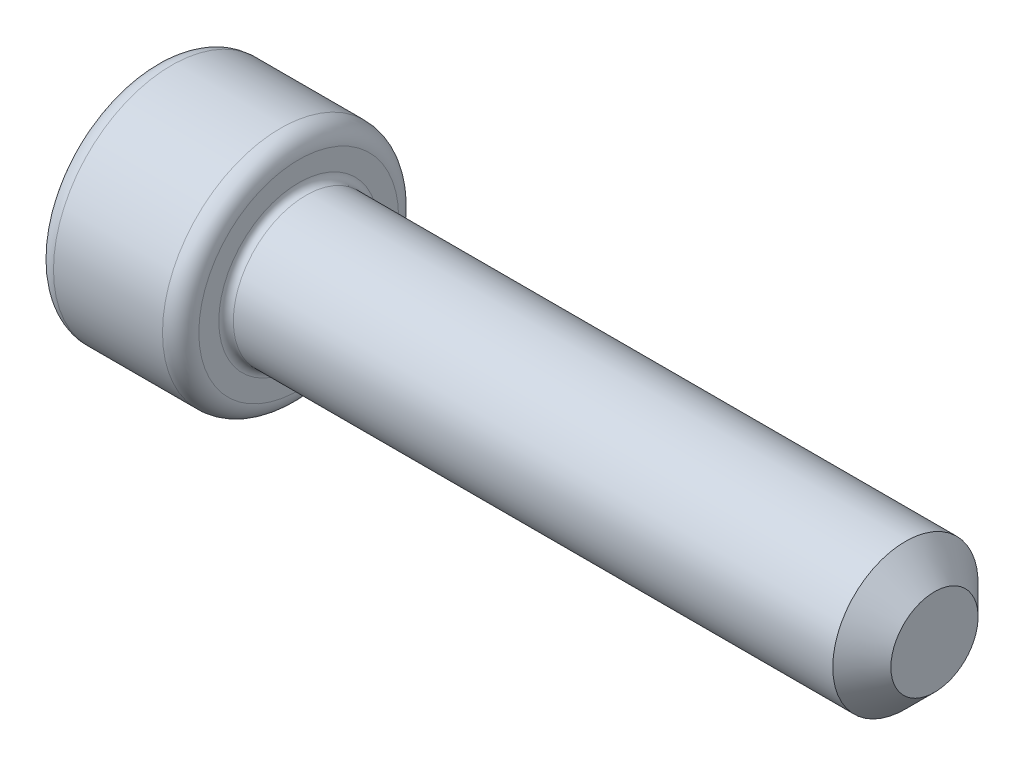
ISO-10303-21;
HEADER;
FILE_DESCRIPTION(('STEP AP214'),'2;1');
FILE_NAME('part.step','',(''),(''),'','','');
FILE_SCHEMA(('AUTOMOTIVE_DESIGN { 1 0 10303 214 1 1 1 1 }'));
ENDSEC;
DATA;
#1=APPLICATION_CONTEXT('core data for automotive mechanical design processes');
#2=APPLICATION_PROTOCOL_DEFINITION('international standard','automotive_design',2000,#1);
#3=PRODUCT_CONTEXT('',#1,'mechanical');
#4=PRODUCT('Part','Part','',(#3));
#5=PRODUCT_RELATED_PRODUCT_CATEGORY('part','',(#4));
#6=PRODUCT_DEFINITION_FORMATION('','',#4);
#7=PRODUCT_DEFINITION_CONTEXT('part definition',#1,'design');
#8=PRODUCT_DEFINITION('design','',#6,#7);
#9=PRODUCT_DEFINITION_SHAPE('','',#8);
#10=(LENGTH_UNIT() NAMED_UNIT(*) SI_UNIT(.MILLI.,.METRE.));
#11=(NAMED_UNIT(*) PLANE_ANGLE_UNIT() SI_UNIT($,.RADIAN.));
#12=(NAMED_UNIT(*) SI_UNIT($,.STERADIAN.) SOLID_ANGLE_UNIT());
#13=UNCERTAINTY_MEASURE_WITH_UNIT(LENGTH_MEASURE(1.E-05),#10,'distance_accuracy_value','');
#14=(GEOMETRIC_REPRESENTATION_CONTEXT(3) GLOBAL_UNCERTAINTY_ASSIGNED_CONTEXT((#13)) GLOBAL_UNIT_ASSIGNED_CONTEXT((#10,
#11,#12)) REPRESENTATION_CONTEXT('',''));
#15=CARTESIAN_POINT('',(0.,0.,0.));
#16=DIRECTION('',(0.,0.,1.));
#17=DIRECTION('',(1.,0.,0.));
#18=AXIS2_PLACEMENT_3D('',#15,#16,#17);
#19=CARTESIAN_POINT('',(0.,0.,0.));
#20=DIRECTION('',(1.,0.,0.));
#21=DIRECTION('',(0.,0.,-1.));
#22=AXIS2_PLACEMENT_3D('',#19,#20,#21);
#23=PLANE('',#22);
#24=CARTESIAN_POINT('',(0.,0.,0.));
#25=DIRECTION('',(-1.,0.,0.));
#26=DIRECTION('',(0.,0.,1.));
#27=AXIS2_PLACEMENT_3D('',#24,#25,#26);
#28=CIRCLE('',#27,3.6);
#29=CARTESIAN_POINT('',(0.,0.,3.6));
#30=VERTEX_POINT('',#29);
#31=EDGE_CURVE('E201',#30,#30,#28,.T.);
#32=ORIENTED_EDGE('',*,*,#31,.F.);
#33=EDGE_LOOP('',(#32));
#34=FACE_BOUND('',#33,.T.);
#35=CARTESIAN_POINT('',(0.,0.,0.));
#36=DIRECTION('',(-1.,0.,0.));
#37=DIRECTION('',(0.,0.,1.));
#38=AXIS2_PLACEMENT_3D('',#35,#36,#37);
#39=CIRCLE('',#38,5.49999999999999);
#40=CARTESIAN_POINT('',(0.,0.,5.49999999999999));
#41=VERTEX_POINT('',#40);
#42=EDGE_CURVE('E51',#41,#41,#39,.T.);
#43=ORIENTED_EDGE('',*,*,#42,.T.);
#44=EDGE_LOOP('',(#43));
#45=FACE_BOUND('',#44,.T.);
#46=ADVANCED_FACE('F38',(#34,#45),#23,.F.);
#47=CARTESIAN_POINT('',(1.,0.,0.));
#48=DIRECTION('',(-1.,0.,0.));
#49=DIRECTION('',(0.,0.,1.));
#50=AXIS2_PLACEMENT_3D('',#47,#48,#49);
#51=TOROIDAL_SURFACE('',#50,5.5,1.);
#52=ORIENTED_EDGE('',*,*,#42,.F.);
#53=EDGE_LOOP('',(#52));
#54=FACE_BOUND('',#53,.T.);
#55=CARTESIAN_POINT('',(1.,0.,0.));
#56=DIRECTION('',(-1.,0.,0.));
#57=DIRECTION('',(0.,0.,1.));
#58=AXIS2_PLACEMENT_3D('',#55,#56,#57);
#59=CIRCLE('',#58,6.5);
#60=CARTESIAN_POINT('',(1.,0.,6.5));
#61=VERTEX_POINT('',#60);
#62=EDGE_CURVE('E139',#61,#61,#59,.T.);
#63=ORIENTED_EDGE('',*,*,#62,.T.);
#64=EDGE_LOOP('',(#63));
#65=FACE_BOUND('',#64,.T.);
#66=ADVANCED_FACE('F145',(#54,#65),#51,.T.);
#67=CARTESIAN_POINT('',(-7.64950422230815,0.,0.));
#68=DIRECTION('',(-1.,0.,0.));
#69=DIRECTION('',(0.,0.,1.));
#70=AXIS2_PLACEMENT_3D('',#67,#68,#69);
#71=CYLINDRICAL_SURFACE('',#70,6.5);
#72=ORIENTED_EDGE('',*,*,#62,.F.);
#73=EDGE_LOOP('',(#72));
#74=FACE_BOUND('',#73,.T.);
#75=CARTESIAN_POINT('',(6.99999999999998,0.,0.));
#76=DIRECTION('',(-1.,0.,0.));
#77=DIRECTION('',(0.,0.,1.));
#78=AXIS2_PLACEMENT_3D('',#75,#76,#77);
#79=CIRCLE('',#78,6.5);
#80=CARTESIAN_POINT('',(6.99999999999998,0.,6.5));
#81=VERTEX_POINT('',#80);
#82=EDGE_CURVE('E136',#81,#81,#79,.T.);
#83=ORIENTED_EDGE('',*,*,#82,.T.);
#84=EDGE_LOOP('',(#83));
#85=FACE_BOUND('',#84,.T.);
#86=ADVANCED_FACE('F148',(#74,#85),#71,.T.);
#87=CARTESIAN_POINT('',(7.00000000000001,0.,0.));
#88=DIRECTION('',(-1.,0.,0.));
#89=DIRECTION('',(0.,0.,1.));
#90=AXIS2_PLACEMENT_3D('',#87,#88,#89);
#91=TOROIDAL_SURFACE('',#90,5.5,1.);
#92=ORIENTED_EDGE('',*,*,#82,.F.);
#93=EDGE_LOOP('',(#92));
#94=FACE_BOUND('',#93,.T.);
#95=CARTESIAN_POINT('',(8.00000000000001,0.,0.));
#96=DIRECTION('',(-1.,0.,0.));
#97=DIRECTION('',(0.,0.,1.));
#98=AXIS2_PLACEMENT_3D('',#95,#96,#97);
#99=CIRCLE('',#98,5.49999999999999);
#100=CARTESIAN_POINT('',(8.00000000000001,0.,5.49999999999999));
#101=VERTEX_POINT('',#100);
#102=EDGE_CURVE('E133',#101,#101,#99,.T.);
#103=ORIENTED_EDGE('',*,*,#102,.T.);
#104=EDGE_LOOP('',(#103));
#105=FACE_BOUND('',#104,.T.);
#106=ADVANCED_FACE('F153',(#94,#105),#91,.T.);
#107=CARTESIAN_POINT('',(8.00000000000001,5.49999999999999,0.));
#108=DIRECTION('',(-1.,0.,0.));
#109=DIRECTION('',(0.,0.,1.));
#110=AXIS2_PLACEMENT_3D('',#107,#108,#109);
#111=PLANE('',#110);
#112=ORIENTED_EDGE('',*,*,#102,.F.);
#113=EDGE_LOOP('',(#112));
#114=FACE_BOUND('',#113,.T.);
#115=CARTESIAN_POINT('',(8.00000000000001,0.,0.));
#116=DIRECTION('',(-1.,0.,0.));
#117=DIRECTION('',(0.,0.,1.));
#118=AXIS2_PLACEMENT_3D('',#115,#116,#117);
#119=CIRCLE('',#118,4.4);
#120=CARTESIAN_POINT('',(8.00000000000001,0.,4.4));
#121=VERTEX_POINT('',#120);
#122=EDGE_CURVE('E130',#121,#121,#119,.T.);
#123=ORIENTED_EDGE('',*,*,#122,.T.);
#124=EDGE_LOOP('',(#123));
#125=FACE_BOUND('',#124,.T.);
#126=ADVANCED_FACE('F159',(#114,#125),#111,.F.);
#127=CARTESIAN_POINT('',(8.39999999999999,0.,0.));
#128=DIRECTION('',(-1.,0.,0.));
#129=DIRECTION('',(0.,0.,1.));
#130=AXIS2_PLACEMENT_3D('',#127,#128,#129);
#131=TOROIDAL_SURFACE('',#130,4.4,0.4);
#132=ORIENTED_EDGE('',*,*,#122,.F.);
#133=EDGE_LOOP('',(#132));
#134=FACE_BOUND('',#133,.T.);
#135=CARTESIAN_POINT('',(8.39999999999999,0.,0.));
#136=DIRECTION('',(-1.,0.,0.));
#137=DIRECTION('',(0.,0.,1.));
#138=AXIS2_PLACEMENT_3D('',#135,#136,#137);
#139=CIRCLE('',#138,4.);
#140=CARTESIAN_POINT('',(8.39999999999999,0.,4.));
#141=VERTEX_POINT('',#140);
#142=EDGE_CURVE('E127',#141,#141,#139,.T.);
#143=ORIENTED_EDGE('',*,*,#142,.T.);
#144=EDGE_LOOP('',(#143));
#145=FACE_BOUND('',#144,.T.);
#146=ADVANCED_FACE('F165',(#134,#145),#131,.F.);
#147=CARTESIAN_POINT('',(-7.64950422230815,0.,0.));
#148=DIRECTION('',(-1.,0.,0.));
#149=DIRECTION('',(0.,0.,1.));
#150=AXIS2_PLACEMENT_3D('',#147,#148,#149);
#151=CYLINDRICAL_SURFACE('',#150,4.);
#152=ORIENTED_EDGE('',*,*,#142,.F.);
#153=EDGE_LOOP('',(#152));
#154=FACE_BOUND('',#153,.T.);
#155=CARTESIAN_POINT('',(41.4,0.,0.));
#156=DIRECTION('',(-1.,0.,0.));
#157=DIRECTION('',(0.,0.,1.));
#158=AXIS2_PLACEMENT_3D('',#155,#156,#157);
#159=CIRCLE('',#158,4.);
#160=CARTESIAN_POINT('',(41.4,0.,4.));
#161=VERTEX_POINT('',#160);
#162=EDGE_CURVE('E124',#161,#161,#159,.T.);
#163=ORIENTED_EDGE('',*,*,#162,.T.);
#164=EDGE_LOOP('',(#163));
#165=FACE_BOUND('',#164,.T.);
#166=ADVANCED_FACE('F171',(#154,#165),#151,.T.);
#167=CARTESIAN_POINT('',(43.,0.,0.));
#168=DIRECTION('',(-1.,0.,0.));
#169=DIRECTION('',(0.,0.,1.));
#170=AXIS2_PLACEMENT_3D('',#167,#168,#169);
#171=CONICAL_SURFACE('',#170,2.40000000000001,0.785398163397445);
#172=ORIENTED_EDGE('',*,*,#162,.F.);
#173=EDGE_LOOP('',(#172));
#174=FACE_BOUND('',#173,.T.);
#175=CARTESIAN_POINT('',(43.,0.,0.));
#176=DIRECTION('',(-1.,0.,0.));
#177=DIRECTION('',(0.,0.,1.));
#178=AXIS2_PLACEMENT_3D('',#175,#176,#177);
#179=CIRCLE('',#178,2.40000000000001);
#180=CARTESIAN_POINT('',(43.,0.,2.40000000000001));
#181=VERTEX_POINT('',#180);
#182=EDGE_CURVE('E121',#181,#181,#179,.T.);
#183=ORIENTED_EDGE('',*,*,#182,.T.);
#184=EDGE_LOOP('',(#183));
#185=FACE_BOUND('',#184,.T.);
#186=ADVANCED_FACE('F177',(#174,#185),#171,.T.);
#187=CARTESIAN_POINT('',(43.,2.4,0.));
#188=DIRECTION('',(-1.,0.,0.));
#189=DIRECTION('',(0.,0.,1.));
#190=AXIS2_PLACEMENT_3D('',#187,#188,#189);
#191=PLANE('',#190);
#192=ORIENTED_EDGE('',*,*,#182,.F.);
#193=EDGE_LOOP('',(#192));
#194=FACE_BOUND('',#193,.T.);
#195=ADVANCED_FACE('F183',(#194),#191,.F.);
#196=CARTESIAN_POINT('',(0.,0.,0.));
#197=DIRECTION('',(-1.,0.,0.));
#198=DIRECTION('',(0.,0.,1.));
#199=AXIS2_PLACEMENT_3D('',#196,#197,#198);
#200=CONICAL_SURFACE('',#199,3.6,1.0471975511966);
#201=ORIENTED_EDGE('',*,*,#31,.T.);
#202=EDGE_LOOP('',(#201));
#203=FACE_BOUND('',#202,.T.);
#204=CARTESIAN_POINT('',(-1.04835789150273,-4.50898974946003,3.));
#205=CARTESIAN_POINT('',(-0.985911238204783,-4.37903809437817,3.));
#206=CARTESIAN_POINT('',(-0.924106690829709,-4.24877207386613,3.));
#207=CARTESIAN_POINT('',(-0.802146398263959,-3.98744339453181,3.));
#208=CARTESIAN_POINT('',(-0.741990946096186,-3.85638059912323,3.));
#209=CARTESIAN_POINT('',(-0.623359494782001,-3.59254393501441,3.));
#210=CARTESIAN_POINT('',(-0.564895796011378,-3.45976451486919,3.));
#211=CARTESIAN_POINT('',(-0.450563076831188,-3.19309725751099,3.));
#212=CARTESIAN_POINT('',(-0.394693922499953,-3.05920947792907,3.));
#213=CARTESIAN_POINT('',(-0.284783756133582,-2.78649755356327,3.));
#214=CARTESIAN_POINT('',(-0.230831867763873,-2.64763727867531,3.));
#215=CARTESIAN_POINT('',(-0.127370015690071,-2.36824044859189,3.));
#216=CARTESIAN_POINT('',(-0.0778605688823405,-2.22770370048162,3.));
#217=CARTESIAN_POINT('',(0.0153111771317814,-1.94504299566512,3.));
#218=CARTESIAN_POINT('',(0.0589866575678043,-1.80292343086955,3.));
#219=CARTESIAN_POINT('',(0.138996373418,-1.51665362384108,3.));
#220=CARTESIAN_POINT('',(0.175333076440408,-1.37250408167064,3.));
#221=CARTESIAN_POINT('',(0.238660111327763,-1.08280597738231,3.));
#222=CARTESIAN_POINT('',(0.265691713100037,-0.937266614059745,3.));
#223=CARTESIAN_POINT('',(0.308767757563844,-0.644539950176818,3.));
#224=CARTESIAN_POINT('',(0.324812982453669,-0.49735276769492,3.));
#225=CARTESIAN_POINT('',(0.344426805068411,-0.203920340872737,3.));
#226=CARTESIAN_POINT('',(0.348144211143898,-0.0576852900481501,3.));
#227=CARTESIAN_POINT('',(0.343170862899566,0.23458302767709,3.));
#228=CARTESIAN_POINT('',(0.334479369322416,0.380616282036957,3.));
#229=CARTESIAN_POINT('',(0.309328698694609,0.63294787460275,3.));
#230=CARTESIAN_POINT('',(0.29553686635057,0.739525196673388,3.));
#231=CARTESIAN_POINT('',(0.262284498813591,0.951798190917157,3.));
#232=CARTESIAN_POINT('',(0.242823068521992,1.05749372116328,3.));
#233=CARTESIAN_POINT('',(0.176968568275512,1.37316914905562,3.));
#234=CARTESIAN_POINT('',(0.123120104686075,1.58160565192266,3.));
#235=CARTESIAN_POINT('',(0.0310004463679456,1.89327160259638,3.));
#236=CARTESIAN_POINT('',(-0.00202524580029439,1.99814168475835,3.));
#237=CARTESIAN_POINT('',(-0.0711849641149794,2.20686176005444,3.));
#238=CARTESIAN_POINT('',(-0.107319012615844,2.31071174584634,3.));
#239=CARTESIAN_POINT('',(-0.18214249236627,2.51743253506361,3.));
#240=CARTESIAN_POINT('',(-0.22083091339055,2.62030370739977,3.));
#241=CARTESIAN_POINT('',(-0.300340275663556,2.82521425892785,3.));
#242=CARTESIAN_POINT('',(-0.341161180550521,2.92725365226846,3.));
#243=CARTESIAN_POINT('',(-0.448689355361287,3.18939644158424,2.99999999999999));
#244=CARTESIAN_POINT('',(-0.516716576635534,3.34895772998079,3.));
#245=CARTESIAN_POINT('',(-0.656101349622328,3.66662357627897,3.));
#246=CARTESIAN_POINT('',(-0.727459160036441,3.82472801987508,3.));
#247=CARTESIAN_POINT('',(-0.872748269669411,4.13979429327009,3.));
#248=CARTESIAN_POINT('',(-0.946680203051514,4.29675582981948,3.));
#249=CARTESIAN_POINT('',(-1.09654235660517,4.60972357454948,3.));
#250=CARTESIAN_POINT('',(-1.17247262255264,4.76572976074474,3.));
#251=CARTESIAN_POINT('',(-1.40279510057643,5.23296563982451,3.));
#252=CARTESIAN_POINT('',(-1.55954155966157,5.54303366901108,3.));
#253=CARTESIAN_POINT('',(-1.87706499490211,6.16102652227095,3.));
#254=CARTESIAN_POINT('',(-2.03784136694506,6.46895165884097,3.));
#255=CARTESIAN_POINT('',(-2.34667843490758,7.05394853100212,3.));
#256=CARTESIAN_POINT('',(-2.49448480186027,7.33115475101331,3.));
#257=CARTESIAN_POINT('',(-2.79178323041716,7.8846761646015,3.));
#258=CARTESIAN_POINT('',(-2.94127536620042,8.16099131827539,3.));
#259=CARTESIAN_POINT('',(-3.24113027332733,8.71221478444681,3.));
#260=CARTESIAN_POINT('',(-3.39148975839338,8.98712488660683,3.));
#261=CARTESIAN_POINT('',(-3.69318538447465,9.53638759945032,3.));
#262=CARTESIAN_POINT('',(-3.8445214669107,9.8107402422974,3.));
#263=CARTESIAN_POINT('',(-3.99621539628012,10.0848935954569,3.));
#264=B_SPLINE_CURVE_WITH_KNOTS('',3,(#204,#205,#206,#207,#208,#209,#210,#211,#212,#213,#214,
#215,#216,#217,#218,#219,#220,#221,#222,#223,#224,#225,#226,#227,#228,#229,#230,#231,#232,#233,
#234,#235,#236,#237,#238,#239,#240,#241,#242,#243,#244,#245,#246,#247,#248,#249,#250,#251,#252,
#253,#254,#255,#256,#257,#258,#259,#260,#261,#262,#263),.UNSPECIFIED.,.F.,.F.,(4,2,2,2,2,2,2,2,
2,2,2,2,2,2,2,2,2,2,2,2,2,2,2,2,2,2,2,2,2,4),(0.,0.432537156188422,0.865150676924343,
1.30037033260171,1.73556749867679,2.1824281284207,2.62934068499826,3.07522576459038,
3.52096066818469,3.96469238116995,4.40839249845344,4.84671685765639,5.28506733102149,
5.60730635380346,5.92959627828533,6.57457353681956,6.90439201959964,7.2342128745393,
7.56390406150447,7.89358962861843,8.41390703437019,8.93426492295023,9.45475192728976,
9.97525086485006,11.0175038591111,12.0596015358246,13.0020426274196,13.9445253524483,
14.8845507308599,15.8245202384158),.UNSPECIFIED.);
#265=CARTESIAN_POINT('',(0.0784609690825389,-1.73205080756888,3.));
#266=VERTEX_POINT('',#265);
#267=CARTESIAN_POINT('',(0.0784609690825389,1.73205080756888,3.));
#268=VERTEX_POINT('',#267);
#269=EDGE_CURVE('E105',#266,#268,#264,.T.);
#270=ORIENTED_EDGE('',*,*,#269,.F.);
#271=CARTESIAN_POINT('',(0.078394299082768,-3.4642170851916,-0.000199999999998812));
#272=CARTESIAN_POINT('',(0.122356457061476,-3.38810199317915,0.131635206588335));
#273=CARTESIAN_POINT('',(0.162338575221149,-3.31132988107607,0.264608405355253));
#274=CARTESIAN_POINT('',(0.232128081068301,-3.15645624025988,0.532857420002057));
#275=CARTESIAN_POINT('',(0.261910779248382,-3.078351959461,0.668138002634338));
#276=CARTESIAN_POINT('',(0.308272322302523,-2.9231113635806,0.937022602096474));
#277=CARTESIAN_POINT('',(0.325159720390847,-2.84599893549863,1.07058524542945));
#278=CARTESIAN_POINT('',(0.34532051906522,-2.69141120014111,1.33833905729568));
#279=CARTESIAN_POINT('',(0.348610613732591,-2.61393645482892,1.47252925247983));
#280=CARTESIAN_POINT('',(0.341769630628292,-2.46916798492017,1.72327559769581));
#281=CARTESIAN_POINT('',(0.333318247321131,-2.40185259973206,1.83986926497268));
#282=CARTESIAN_POINT('',(0.306531218506758,-2.2676603930218,2.07229698497465));
#283=CARTESIAN_POINT('',(0.288186420652061,-2.2007840357172,2.18813023365135));
#284=CARTESIAN_POINT('',(0.242325410660436,-2.06631510305814,2.42103725705638));
#285=CARTESIAN_POINT('',(0.214614776250691,-1.9987395487233,2.53808155051396));
#286=CARTESIAN_POINT('',(0.151722366376361,-1.86459637060759,2.77042435049914));
#287=CARTESIAN_POINT('',(0.116555370492182,-1.79802702797161,2.88572583417112));
#288=CARTESIAN_POINT('',(0.0783942990826569,-1.73193533751504,3.0002));
#289=B_SPLINE_CURVE_WITH_KNOTS('',3,(#271,#272,#273,#274,#275,#276,#277,#278,#279,#280,#281,
#282,#283,#284,#285,#286,#287,#288),.UNSPECIFIED.,.F.,.F.,(4,2,2,2,2,2,2,2,4),(0.,
0.475539830103044,0.952222784107952,1.41710776961286,1.88142182298025,2.28572436316091,
2.6904015647504,3.10405572063577,3.51689749407072),.UNSPECIFIED.);
#290=CARTESIAN_POINT('',(0.0784609690826499,-3.46410161513776,0.));
#291=VERTEX_POINT('',#290);
#292=EDGE_CURVE('E268',#291,#266,#289,.T.);
#293=ORIENTED_EDGE('',*,*,#292,.F.);
#294=CARTESIAN_POINT('',(0.0783942990826847,-1.73193533751504,-3.0002));
#295=CARTESIAN_POINT('',(0.122356457061442,-1.80805042952748,-2.86836479341168));
#296=CARTESIAN_POINT('',(0.162338575221137,-1.88482254163056,-2.73539159464476));
#297=CARTESIAN_POINT('',(0.232128081068309,-2.03969618244675,-2.46714257999796));
#298=CARTESIAN_POINT('',(0.261910779248386,-2.11780046324563,-2.33186199736567));
#299=CARTESIAN_POINT('',(0.30827232230252,-2.27304105912604,-2.06297739790353));
#300=CARTESIAN_POINT('',(0.32515972039084,-2.35015348720801,-1.92941475457055));
#301=CARTESIAN_POINT('',(0.345320519065229,-2.50474122256553,-1.66166094270432));
#302=CARTESIAN_POINT('',(0.34861061373262,-2.58221596787771,-1.52747074752016));
#303=CARTESIAN_POINT('',(0.341769630628318,-2.72698443778647,-1.27672440230419));
#304=CARTESIAN_POINT('',(0.333318247321138,-2.79429982297457,-1.16013073502732));
#305=CARTESIAN_POINT('',(0.306531218506754,-2.92849202968484,-0.927703015025358));
#306=CARTESIAN_POINT('',(0.288186420652064,-2.99536838698944,-0.811869766348665));
#307=CARTESIAN_POINT('',(0.242325410660439,-3.12983731964849,-0.578962742943631));
#308=CARTESIAN_POINT('',(0.214614776250687,-3.19741287398332,-0.46191844948606));
#309=CARTESIAN_POINT('',(0.151722366376375,-3.33155605209904,-0.229575649500878));
#310=CARTESIAN_POINT('',(0.116555370492224,-3.39812539473502,-0.114274165828895));
#311=CARTESIAN_POINT('',(0.078394299082768,-3.4642170851916,0.000199999999998812));
#312=B_SPLINE_CURVE_WITH_KNOTS('',3,(#294,#295,#296,#297,#298,#299,#300,#301,#302,#303,#304,
#305,#306,#307,#308,#309,#310,#311),.UNSPECIFIED.,.F.,.F.,(4,2,2,2,2,2,2,2,4),(0.,
0.475539830103052,0.95222278410797,1.41710776961289,1.88142182298028,2.28572436316093,
2.69040156475041,3.10405572063577,3.51689749407072),.UNSPECIFIED.);
#313=CARTESIAN_POINT('',(0.0784609690825944,-1.73205080756888,-3.));
#314=VERTEX_POINT('',#313);
#315=EDGE_CURVE('E203',#314,#291,#312,.T.);
#316=ORIENTED_EDGE('',*,*,#315,.F.);
#317=CARTESIAN_POINT('',(-1.0483578915027,-4.50898974946003,-3.));
#318=CARTESIAN_POINT('',(-0.98591123820477,-4.37903809437817,-3.));
#319=CARTESIAN_POINT('',(-0.924106690829702,-4.24877207386612,-3.));
#320=CARTESIAN_POINT('',(-0.802146398263958,-3.9874433945318,-3.));
#321=CARTESIAN_POINT('',(-0.741990946096183,-3.85638059912322,-3.));
#322=CARTESIAN_POINT('',(-0.623359494781997,-3.5925439350144,-3.));
#323=CARTESIAN_POINT('',(-0.564895796011375,-3.45976451486918,-3.));
#324=CARTESIAN_POINT('',(-0.450563076831184,-3.19309725751098,-3.));
#325=CARTESIAN_POINT('',(-0.394693922499949,-3.05920947792906,-3.));
#326=CARTESIAN_POINT('',(-0.284783756133578,-2.78649755356325,-3.));
#327=CARTESIAN_POINT('',(-0.230831867763869,-2.6476372786753,-3.));
#328=CARTESIAN_POINT('',(-0.127370015690067,-2.36824044859188,-3.));
#329=CARTESIAN_POINT('',(-0.0778605688823345,-2.2277037004816,-3.));
#330=CARTESIAN_POINT('',(0.0153111771317832,-1.9450429956651,-3.));
#331=CARTESIAN_POINT('',(0.0589866575678006,-1.80292343086953,-3.));
#332=CARTESIAN_POINT('',(0.13899637341801,-1.51665362384107,-3.));
#333=CARTESIAN_POINT('',(0.175333076440437,-1.37250408167063,-3.));
#334=CARTESIAN_POINT('',(0.23866011132779,-1.08280597738231,-3.));
#335=CARTESIAN_POINT('',(0.265691713100044,-0.937266614059742,-3.));
#336=CARTESIAN_POINT('',(0.308767757563838,-0.644539950176813,-3.));
#337=CARTESIAN_POINT('',(0.324812982453669,-0.497352767694917,-3.));
#338=CARTESIAN_POINT('',(0.34442680506841,-0.203920340872735,-3.));
#339=CARTESIAN_POINT('',(0.34814421114389,-0.0576852900481483,-3.));
#340=CARTESIAN_POINT('',(0.343170862899575,0.234583027677093,-3.));
#341=CARTESIAN_POINT('',(0.334479369322447,0.38061628203696,-3.));
#342=CARTESIAN_POINT('',(0.309328698694634,0.632947874602751,-3.));
#343=CARTESIAN_POINT('',(0.295536866350577,0.739525196673386,-3.));
#344=CARTESIAN_POINT('',(0.262284498813585,0.951798190917152,-3.));
#345=CARTESIAN_POINT('',(0.242823068521991,1.05749372116328,-3.));
#346=CARTESIAN_POINT('',(0.176968568275519,1.37316914905561,-3.));
#347=CARTESIAN_POINT('',(0.123120104686078,1.58160565192265,-3.));
#348=CARTESIAN_POINT('',(0.0310004463679468,1.89327160259638,-3.));
#349=CARTESIAN_POINT('',(-0.00202524580029321,1.99814168475834,-3.));
#350=CARTESIAN_POINT('',(-0.0711849641149772,2.20686176005443,-3.));
#351=CARTESIAN_POINT('',(-0.107319012615841,2.31071174584633,-3.));
#352=CARTESIAN_POINT('',(-0.182142492366269,2.5174325350636,-3.));
#353=CARTESIAN_POINT('',(-0.220830913390553,2.62030370739977,-3.));
#354=CARTESIAN_POINT('',(-0.300340275663548,2.82521425892785,-3.));
#355=CARTESIAN_POINT('',(-0.341161180550497,2.92725365226846,-3.));
#356=CARTESIAN_POINT('',(-0.448689355361252,3.18939644158425,-3.));
#357=CARTESIAN_POINT('',(-0.516716576635522,3.34895772998079,-3.));
#358=CARTESIAN_POINT('',(-0.656101349622332,3.66662357627895,-3.));
#359=CARTESIAN_POINT('',(-0.727459160036438,3.82472801987507,-3.));
#360=CARTESIAN_POINT('',(-0.872748269669403,4.13979429327008,-3.));
#361=CARTESIAN_POINT('',(-0.946680203051507,4.29675582981947,-3.));
#362=CARTESIAN_POINT('',(-1.09654235660517,4.60972357454947,-3.));
#363=CARTESIAN_POINT('',(-1.17247262255264,4.76572976074473,-3.));
#364=CARTESIAN_POINT('',(-1.40279510057642,5.2329656398245,-3.));
#365=CARTESIAN_POINT('',(-1.55954155966157,5.54303366901107,-3.));
#366=CARTESIAN_POINT('',(-1.87706499490211,6.16102652227094,-3.));
#367=CARTESIAN_POINT('',(-2.03784136694505,6.46895165884096,-3.));
#368=CARTESIAN_POINT('',(-2.34667843490757,7.05394853100211,-3.));
#369=CARTESIAN_POINT('',(-2.49448480186027,7.3311547510133,-3.));
#370=CARTESIAN_POINT('',(-2.79178323041715,7.88467616460149,-3.));
#371=CARTESIAN_POINT('',(-2.94127536620042,8.16099131827538,-3.));
#372=CARTESIAN_POINT('',(-3.24113027332733,8.7122147844468,-3.));
#373=CARTESIAN_POINT('',(-3.39148975839338,8.98712488660682,-3.));
#374=CARTESIAN_POINT('',(-3.69318538447464,9.53638759945031,-3.));
#375=CARTESIAN_POINT('',(-3.84452146691068,9.81074024229739,-3.));
#376=CARTESIAN_POINT('',(-3.99621539628009,10.0848935954569,-3.));
#377=B_SPLINE_CURVE_WITH_KNOTS('',3,(#317,#318,#319,#320,#321,#322,#323,#324,#325,#326,#327,
#328,#329,#330,#331,#332,#333,#334,#335,#336,#337,#338,#339,#340,#341,#342,#343,#344,#345,#346,
#347,#348,#349,#350,#351,#352,#353,#354,#355,#356,#357,#358,#359,#360,#361,#362,#363,#364,#365,
#366,#367,#368,#369,#370,#371,#372,#373,#374,#375,#376),.UNSPECIFIED.,.F.,.F.,(4,2,2,2,2,2,2,2,
2,2,2,2,2,2,2,2,2,2,2,2,2,2,2,2,2,2,2,2,2,4),(0.,0.432537156188419,0.865150676924337,
1.3003703326017,1.73556749867678,2.1824281284207,2.62934068499826,3.07522576459038,
3.52096066818468,3.96469238116995,4.40839249845344,4.84671685765638,5.28506733102148,
5.60730635380345,5.92959627828531,6.57457353681954,6.90439201959962,7.23421287453928,
7.56390406150445,7.89358962861841,8.41390703437017,8.93426492295021,9.45475192728974,
9.97525086485004,11.017503859111,12.0596015358246,13.0020426274196,13.9445253524483,
14.8845507308599,15.8245202384158),.UNSPECIFIED.);
#378=CARTESIAN_POINT('',(0.0784609690825944,1.73205080756888,-3.));
#379=VERTEX_POINT('',#378);
#380=EDGE_CURVE('E58',#379,#314,#377,.F.);
#381=ORIENTED_EDGE('',*,*,#380,.F.);
#382=CARTESIAN_POINT('',(0.078394299082768,3.46421708519159,0.000199999999998812));
#383=CARTESIAN_POINT('',(0.122356457061476,3.38810199317915,-0.131635206588334));
#384=CARTESIAN_POINT('',(0.16233857522115,3.31132988107606,-0.264608405355253));
#385=CARTESIAN_POINT('',(0.232128081068306,3.15645624025988,-0.532857420002058));
#386=CARTESIAN_POINT('',(0.261910779248387,3.078351959461,-0.668138002634341));
#387=CARTESIAN_POINT('',(0.308272322302524,2.92311136358059,-0.937022602096479));
#388=CARTESIAN_POINT('',(0.325159720390843,2.84599893549862,-1.07058524542946));
#389=CARTESIAN_POINT('',(0.34532051906523,2.6914112001411,-1.33833905729569));
#390=CARTESIAN_POINT('',(0.34861061373262,2.61393645482892,-1.47252925247984));
#391=CARTESIAN_POINT('',(0.341769630628318,2.46916798492017,-1.72327559769581));
#392=CARTESIAN_POINT('',(0.333318247321139,2.40185259973206,-1.83986926497268));
#393=CARTESIAN_POINT('',(0.306531218506753,2.26766039302179,-2.07229698497465));
#394=CARTESIAN_POINT('',(0.288186420652062,2.20078403571719,-2.18813023365134));
#395=CARTESIAN_POINT('',(0.24232541066044,2.06631510305814,-2.42103725705638));
#396=CARTESIAN_POINT('',(0.214614776250693,1.9987395487233,-2.53808155051395));
#397=CARTESIAN_POINT('',(0.151722366376365,1.86459637060759,-2.77042435049914));
#398=CARTESIAN_POINT('',(0.116555370492192,1.79802702797161,-2.88572583417112));
#399=CARTESIAN_POINT('',(0.0783942990826847,1.73193533751504,-3.0002));
#400=B_SPLINE_CURVE_WITH_KNOTS('',3,(#382,#383,#384,#385,#386,#387,#388,#389,#390,#391,#392,
#393,#394,#395,#396,#397,#398,#399),.UNSPECIFIED.,.F.,.F.,(4,2,2,2,2,2,2,2,4),(0.,
0.475539830103045,0.952222784107958,1.41710776961287,1.88142182298025,2.28572436316091,
2.69040156475039,3.10405572063577,3.51689749407072),.UNSPECIFIED.);
#401=CARTESIAN_POINT('',(0.0784609690826499,3.46410161513775,0.));
#402=VERTEX_POINT('',#401);
#403=EDGE_CURVE('E11',#402,#379,#400,.T.);
#404=ORIENTED_EDGE('',*,*,#403,.F.);
#405=CARTESIAN_POINT('',(0.0783942990826569,1.73193533751504,3.0002));
#406=CARTESIAN_POINT('',(0.122356457061434,1.80805042952748,2.86836479341168));
#407=CARTESIAN_POINT('',(0.162338575221135,1.88482254163056,2.73539159464476));
#408=CARTESIAN_POINT('',(0.23212808106831,2.03969618244675,2.46714257999796));
#409=CARTESIAN_POINT('',(0.261910779248384,2.11780046324562,2.33186199736567));
#410=CARTESIAN_POINT('',(0.308272322302521,2.27304105912604,2.06297739790353));
#411=CARTESIAN_POINT('',(0.325159720390848,2.35015348720801,1.92941475457056));
#412=CARTESIAN_POINT('',(0.345320519065222,2.50474122256553,1.66166094270432));
#413=CARTESIAN_POINT('',(0.348610613732591,2.58221596787771,1.52747074752016));
#414=CARTESIAN_POINT('',(0.341769630628292,2.72698443778647,1.27672440230419));
#415=CARTESIAN_POINT('',(0.333318247321131,2.79429982297457,1.16013073502732));
#416=CARTESIAN_POINT('',(0.306531218506761,2.92849202968484,0.927703015025356));
#417=CARTESIAN_POINT('',(0.288186420652067,2.99536838698944,0.811869766348663));
#418=CARTESIAN_POINT('',(0.242325410660438,3.12983731964849,0.578962742943631));
#419=CARTESIAN_POINT('',(0.214614776250687,3.19741287398332,0.461918449486061));
#420=CARTESIAN_POINT('',(0.151722366376377,3.33155605209904,0.229575649500879));
#421=CARTESIAN_POINT('',(0.116555370492226,3.39812539473502,0.114274165828896));
#422=CARTESIAN_POINT('',(0.078394299082768,3.46421708519159,-0.000199999999998812));
#423=B_SPLINE_CURVE_WITH_KNOTS('',3,(#405,#406,#407,#408,#409,#410,#411,#412,#413,#414,#415,
#416,#417,#418,#419,#420,#421,#422),.UNSPECIFIED.,.F.,.F.,(4,2,2,2,2,2,2,2,4),(0.,
0.475539830103055,0.95222278410797,1.41710776961289,1.88142182298028,2.28572436316094,
2.69040156475041,3.10405572063577,3.51689749407072),.UNSPECIFIED.);
#424=EDGE_CURVE('E96',#268,#402,#423,.T.);
#425=ORIENTED_EDGE('',*,*,#424,.F.);
#426=EDGE_LOOP('',(#270,#293,#316,#381,#404,#425));
#427=FACE_BOUND('',#426,.T.);
#428=ADVANCED_FACE('F95',(#203,#427),#200,.F.);
#429=CARTESIAN_POINT('',(4.,0.,0.));
#430=DIRECTION('',(-1.,0.,0.));
#431=DIRECTION('',(0.,0.,1.));
#432=AXIS2_PLACEMENT_3D('',#429,#430,#431);
#433=PLANE('',#432);
#434=DIRECTION('',(0.,0.5,-0.866025403784439));
#435=VECTOR('',#434,1.);
#436=CARTESIAN_POINT('',(3.99999999999989,1.73205080756888,3.));
#437=LINE('',#436,#435);
#438=CARTESIAN_POINT('',(3.99999999999989,1.73205080756888,3.));
#439=VERTEX_POINT('',#438);
#440=CARTESIAN_POINT('',(4.,3.46410161513775,0.));
#441=VERTEX_POINT('',#440);
#442=EDGE_CURVE('E104',#439,#441,#437,.T.);
#443=ORIENTED_EDGE('',*,*,#442,.T.);
#444=DIRECTION('',(0.,-0.5,-0.866025403784439));
#445=VECTOR('',#444,1.);
#446=CARTESIAN_POINT('',(4.,3.46410161513775,0.));
#447=LINE('',#446,#445);
#448=CARTESIAN_POINT('',(3.99999999999992,1.73205080756888,-3.));
#449=VERTEX_POINT('',#448);
#450=EDGE_CURVE('E109',#441,#449,#447,.T.);
#451=ORIENTED_EDGE('',*,*,#450,.T.);
#452=DIRECTION('',(0.,-1.,0.));
#453=VECTOR('',#452,1.);
#454=CARTESIAN_POINT('',(3.99999999999992,1.73205080756888,-3.));
#455=LINE('',#454,#453);
#456=CARTESIAN_POINT('',(3.99999999999992,-1.73205080756888,-3.));
#457=VERTEX_POINT('',#456);
#458=EDGE_CURVE('E244',#449,#457,#455,.T.);
#459=ORIENTED_EDGE('',*,*,#458,.T.);
#460=DIRECTION('',(0.,-0.5,0.866025403784439));
#461=VECTOR('',#460,1.);
#462=CARTESIAN_POINT('',(3.99999999999992,-1.73205080756888,-3.));
#463=LINE('',#462,#461);
#464=CARTESIAN_POINT('',(4.,-3.46410161513776,0.));
#465=VERTEX_POINT('',#464);
#466=EDGE_CURVE('E247',#457,#465,#463,.T.);
#467=ORIENTED_EDGE('',*,*,#466,.T.);
#468=DIRECTION('',(0.,0.5,0.866025403784439));
#469=VECTOR('',#468,1.);
#470=CARTESIAN_POINT('',(4.,-3.46410161513776,0.));
#471=LINE('',#470,#469);
#472=CARTESIAN_POINT('',(3.99999999999989,-1.73205080756888,3.));
#473=VERTEX_POINT('',#472);
#474=EDGE_CURVE('E117',#465,#473,#471,.T.);
#475=ORIENTED_EDGE('',*,*,#474,.T.);
#476=DIRECTION('',(0.,1.,0.));
#477=VECTOR('',#476,1.);
#478=CARTESIAN_POINT('',(3.99999999999989,-1.73205080756888,3.));
#479=LINE('',#478,#477);
#480=EDGE_CURVE('E112',#473,#439,#479,.T.);
#481=ORIENTED_EDGE('',*,*,#480,.T.);
#482=EDGE_LOOP('',(#443,#451,#459,#467,#475,#481));
#483=FACE_BOUND('',#482,.T.);
#484=ADVANCED_FACE('F192',(#483),#433,.T.);
#485=CARTESIAN_POINT('',(4.,3.46410161513775,0.));
#486=DIRECTION('',(0.,0.866025403784439,-0.5));
#487=DIRECTION('',(0.,0.5,0.866025403784439));
#488=AXIS2_PLACEMENT_3D('',#485,#486,#487);
#489=PLANE('',#488);
#490=DIRECTION('',(-1.,0.,0.));
#491=VECTOR('',#490,1.);
#492=CARTESIAN_POINT('',(4.,3.46410161513775,0.));
#493=LINE('',#492,#491);
#494=EDGE_CURVE('E102',#441,#402,#493,.T.);
#495=ORIENTED_EDGE('',*,*,#494,.T.);
#496=ORIENTED_EDGE('',*,*,#403,.T.);
#497=DIRECTION('',(-1.,0.,0.));
#498=VECTOR('',#497,1.);
#499=CARTESIAN_POINT('',(3.99999999999992,1.73205080756888,-3.));
#500=LINE('',#499,#498);
#501=EDGE_CURVE('E111',#449,#379,#500,.T.);
#502=ORIENTED_EDGE('',*,*,#501,.F.);
#503=ORIENTED_EDGE('',*,*,#450,.F.);
#504=EDGE_LOOP('',(#495,#496,#502,#503));
#505=FACE_BOUND('',#504,.T.);
#506=ADVANCED_FACE('F107',(#505),#489,.F.);
#507=CARTESIAN_POINT('',(3.99999999999992,1.73205080756888,-3.));
#508=DIRECTION('',(0.,0.,-1.));
#509=DIRECTION('',(-1.,0.,0.));
#510=AXIS2_PLACEMENT_3D('',#507,#508,#509);
#511=PLANE('',#510);
#512=ORIENTED_EDGE('',*,*,#501,.T.);
#513=ORIENTED_EDGE('',*,*,#380,.T.);
#514=DIRECTION('',(-1.,0.,0.));
#515=VECTOR('',#514,1.);
#516=CARTESIAN_POINT('',(3.99999999999992,-1.73205080756888,-3.));
#517=LINE('',#516,#515);
#518=EDGE_CURVE('E114',#457,#314,#517,.T.);
#519=ORIENTED_EDGE('',*,*,#518,.F.);
#520=ORIENTED_EDGE('',*,*,#458,.F.);
#521=EDGE_LOOP('',(#512,#513,#519,#520));
#522=FACE_BOUND('',#521,.T.);
#523=ADVANCED_FACE('F219',(#522),#511,.F.);
#524=CARTESIAN_POINT('',(3.99999999999992,-1.73205080756888,-3.));
#525=DIRECTION('',(0.,-0.866025403784439,-0.5));
#526=DIRECTION('',(0.,0.5,-0.866025403784439));
#527=AXIS2_PLACEMENT_3D('',#524,#525,#526);
#528=PLANE('',#527);
#529=ORIENTED_EDGE('',*,*,#518,.T.);
#530=ORIENTED_EDGE('',*,*,#315,.T.);
#531=DIRECTION('',(-1.,0.,0.));
#532=VECTOR('',#531,1.);
#533=CARTESIAN_POINT('',(4.,-3.46410161513776,0.));
#534=LINE('',#533,#532);
#535=EDGE_CURVE('E256',#465,#291,#534,.T.);
#536=ORIENTED_EDGE('',*,*,#535,.F.);
#537=ORIENTED_EDGE('',*,*,#466,.F.);
#538=EDGE_LOOP('',(#529,#530,#536,#537));
#539=FACE_BOUND('',#538,.T.);
#540=ADVANCED_FACE('F222',(#539),#528,.F.);
#541=CARTESIAN_POINT('',(4.,-3.46410161513776,0.));
#542=DIRECTION('',(0.,-0.866025403784439,0.5));
#543=DIRECTION('',(0.,-0.5,-0.866025403784439));
#544=AXIS2_PLACEMENT_3D('',#541,#542,#543);
#545=PLANE('',#544);
#546=ORIENTED_EDGE('',*,*,#535,.T.);
#547=ORIENTED_EDGE('',*,*,#292,.T.);
#548=DIRECTION('',(-1.,0.,0.));
#549=VECTOR('',#548,1.);
#550=CARTESIAN_POINT('',(3.99999999999989,-1.73205080756888,3.));
#551=LINE('',#550,#549);
#552=EDGE_CURVE('E253',#473,#266,#551,.T.);
#553=ORIENTED_EDGE('',*,*,#552,.F.);
#554=ORIENTED_EDGE('',*,*,#474,.F.);
#555=EDGE_LOOP('',(#546,#547,#553,#554));
#556=FACE_BOUND('',#555,.T.);
#557=ADVANCED_FACE('F267',(#556),#545,.F.);
#558=CARTESIAN_POINT('',(3.99999999999989,-1.73205080756888,3.));
#559=DIRECTION('',(0.,0.,1.));
#560=DIRECTION('',(1.,0.,0.));
#561=AXIS2_PLACEMENT_3D('',#558,#559,#560);
#562=PLANE('',#561);
#563=ORIENTED_EDGE('',*,*,#552,.T.);
#564=ORIENTED_EDGE('',*,*,#269,.T.);
#565=DIRECTION('',(-1.,0.,0.));
#566=VECTOR('',#565,1.);
#567=CARTESIAN_POINT('',(3.99999999999989,1.73205080756888,3.));
#568=LINE('',#567,#566);
#569=EDGE_CURVE('E65',#439,#268,#568,.T.);
#570=ORIENTED_EDGE('',*,*,#569,.F.);
#571=ORIENTED_EDGE('',*,*,#480,.F.);
#572=EDGE_LOOP('',(#563,#564,#570,#571));
#573=FACE_BOUND('',#572,.T.);
#574=ADVANCED_FACE('F230',(#573),#562,.F.);
#575=CARTESIAN_POINT('',(3.99999999999989,1.73205080756888,3.));
#576=DIRECTION('',(0.,0.866025403784439,0.5));
#577=DIRECTION('',(0.,-0.5,0.866025403784439));
#578=AXIS2_PLACEMENT_3D('',#575,#576,#577);
#579=PLANE('',#578);
#580=ORIENTED_EDGE('',*,*,#569,.T.);
#581=ORIENTED_EDGE('',*,*,#424,.T.);
#582=ORIENTED_EDGE('',*,*,#494,.F.);
#583=ORIENTED_EDGE('',*,*,#442,.F.);
#584=EDGE_LOOP('',(#580,#581,#582,#583));
#585=FACE_BOUND('',#584,.T.);
#586=ADVANCED_FACE('F101',(#585),#579,.F.);
#587=CLOSED_SHELL('',(#46,#66,#86,#106,#126,#146,#166,#186,#195,#428,#484,#506,#523,#540,#557,
#574,#586));
#588=MANIFOLD_SOLID_BREP('B2',#587);
#589=ADVANCED_BREP_SHAPE_REPRESENTATION('',(#18,#588),#14);
#590=SHAPE_DEFINITION_REPRESENTATION(#9,#589);
ENDSEC;
END-ISO-10303-21;
